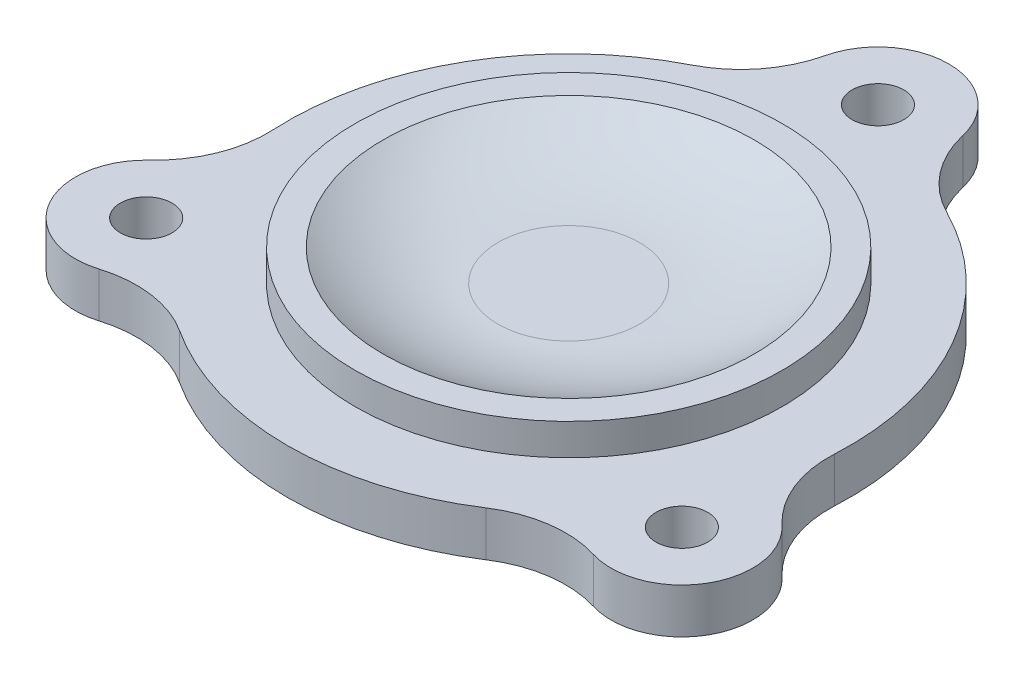
ISO-10303-21;
HEADER;
FILE_DESCRIPTION(('STEP AP214'),'2;1');
FILE_NAME('part.step','',(''),(''),'','','');
FILE_SCHEMA(('AUTOMOTIVE_DESIGN { 1 0 10303 214 1 1 1 1 }'));
ENDSEC;
DATA;
#1=APPLICATION_CONTEXT('core data for automotive mechanical design processes');
#2=APPLICATION_PROTOCOL_DEFINITION('international standard','automotive_design',2000,#1);
#3=PRODUCT_CONTEXT('',#1,'mechanical');
#4=PRODUCT('Part','Part','',(#3));
#5=PRODUCT_RELATED_PRODUCT_CATEGORY('part','',(#4));
#6=PRODUCT_DEFINITION_FORMATION('','',#4);
#7=PRODUCT_DEFINITION_CONTEXT('part definition',#1,'design');
#8=PRODUCT_DEFINITION('design','',#6,#7);
#9=PRODUCT_DEFINITION_SHAPE('','',#8);
#10=(LENGTH_UNIT() NAMED_UNIT(*) SI_UNIT(.MILLI.,.METRE.));
#11=(NAMED_UNIT(*) PLANE_ANGLE_UNIT() SI_UNIT($,.RADIAN.));
#12=(NAMED_UNIT(*) SI_UNIT($,.STERADIAN.) SOLID_ANGLE_UNIT());
#13=UNCERTAINTY_MEASURE_WITH_UNIT(LENGTH_MEASURE(1.E-05),#10,'distance_accuracy_value','');
#14=(GEOMETRIC_REPRESENTATION_CONTEXT(3) GLOBAL_UNCERTAINTY_ASSIGNED_CONTEXT((#13)) GLOBAL_UNIT_ASSIGNED_CONTEXT((#10,
#11,#12)) REPRESENTATION_CONTEXT('',''));
#15=CARTESIAN_POINT('',(0.,0.,0.));
#16=DIRECTION('',(0.,0.,1.));
#17=DIRECTION('',(1.,0.,0.));
#18=AXIS2_PLACEMENT_3D('',#15,#16,#17);
#19=CARTESIAN_POINT('',(0.,2.,0.));
#20=DIRECTION('',(0.,-1.,0.));
#21=DIRECTION('',(0.,0.,-1.));
#22=AXIS2_PLACEMENT_3D('',#19,#20,#21);
#23=CYLINDRICAL_SURFACE('',#22,12.5);
#24=DIRECTION('',(0.,1.,0.));
#25=VECTOR('',#24,1.);
#26=CARTESIAN_POINT('',(-6.81245686136395,-12.8233262650801,10.4804785917464));
#27=LINE('',#26,#25);
#28=CARTESIAN_POINT('',(-6.81245686136395,0.,10.4804785917464));
#29=VERTEX_POINT('',#28);
#30=CARTESIAN_POINT('',(-6.81245686136395,2.,10.4804785917464));
#31=VERTEX_POINT('',#30);
#32=EDGE_CURVE('E151',#29,#31,#27,.T.);
#33=ORIENTED_EDGE('',*,*,#32,.F.);
#34=CARTESIAN_POINT('',(0.,0.,0.));
#35=DIRECTION('',(0.,1.,0.));
#36=DIRECTION('',(0.,0.,1.));
#37=AXIS2_PLACEMENT_3D('',#34,#35,#36);
#38=CIRCLE('',#37,12.5);
#39=CARTESIAN_POINT('',(6.81245686136395,0.,10.4804785917464));
#40=VERTEX_POINT('',#39);
#41=EDGE_CURVE('E236',#29,#40,#38,.T.);
#42=ORIENTED_EDGE('',*,*,#41,.T.);
#43=DIRECTION('',(0.,1.,0.));
#44=VECTOR('',#43,1.);
#45=CARTESIAN_POINT('',(6.81245686136395,-12.8233262650801,10.4804785917464));
#46=LINE('',#45,#44);
#47=CARTESIAN_POINT('',(6.81245686136395,2.,10.4804785917464));
#48=VERTEX_POINT('',#47);
#49=EDGE_CURVE('E187',#40,#48,#46,.T.);
#50=ORIENTED_EDGE('',*,*,#49,.T.);
#51=CARTESIAN_POINT('',(0.,2.,0.));
#52=DIRECTION('',(0.,1.,0.));
#53=DIRECTION('',(0.,0.,1.));
#54=AXIS2_PLACEMENT_3D('',#51,#52,#53);
#55=CIRCLE('',#54,12.5);
#56=EDGE_CURVE('E52',#31,#48,#55,.T.);
#57=ORIENTED_EDGE('',*,*,#56,.F.);
#58=EDGE_LOOP('',(#33,#42,#50,#57));
#59=FACE_BOUND('',#58,.T.);
#60=ADVANCED_FACE('F37',(#59),#23,.T.);
#61=DIRECTION('',(0.,1.,0.));
#62=VECTOR('',#61,1.);
#63=CARTESIAN_POINT('',(12.4825891349533,-12.8233262650801,0.659521408253566));
#64=LINE('',#63,#62);
#65=CARTESIAN_POINT('',(12.4825891349533,0.,0.659521408253566));
#66=VERTEX_POINT('',#65);
#67=CARTESIAN_POINT('',(12.4825891349533,2.,0.659521408253566));
#68=VERTEX_POINT('',#67);
#69=EDGE_CURVE('E183',#66,#68,#64,.T.);
#70=ORIENTED_EDGE('',*,*,#69,.F.);
#71=CARTESIAN_POINT('',(5.67013227358939,0.,-11.14));
#72=VERTEX_POINT('',#71);
#73=EDGE_CURVE('E231',#66,#72,#38,.T.);
#74=ORIENTED_EDGE('',*,*,#73,.T.);
#75=DIRECTION('',(0.,1.,0.));
#76=VECTOR('',#75,1.);
#77=CARTESIAN_POINT('',(5.67013227358939,-12.8233262650801,-11.14));
#78=LINE('',#77,#76);
#79=CARTESIAN_POINT('',(5.67013227358939,2.,-11.14));
#80=VERTEX_POINT('',#79);
#81=EDGE_CURVE('E217',#72,#80,#78,.T.);
#82=ORIENTED_EDGE('',*,*,#81,.T.);
#83=EDGE_CURVE('E234',#68,#80,#55,.T.);
#84=ORIENTED_EDGE('',*,*,#83,.F.);
#85=EDGE_LOOP('',(#70,#74,#82,#84));
#86=FACE_BOUND('',#85,.T.);
#87=ADVANCED_FACE('F240',(#86),#23,.T.);
#88=CARTESIAN_POINT('',(-5.67013227358939,0.,-11.14));
#89=VERTEX_POINT('',#88);
#90=CARTESIAN_POINT('',(-12.4825891349533,0.,0.659521408253576));
#91=VERTEX_POINT('',#90);
#92=EDGE_CURVE('E235',#89,#91,#38,.T.);
#93=ORIENTED_EDGE('',*,*,#92,.T.);
#94=DIRECTION('',(0.,1.,0.));
#95=VECTOR('',#94,1.);
#96=CARTESIAN_POINT('',(-12.4825891349533,-12.8233262650801,0.659521408253575));
#97=LINE('',#96,#95);
#98=CARTESIAN_POINT('',(-12.4825891349533,2.,0.659521408253576));
#99=VERTEX_POINT('',#98);
#100=EDGE_CURVE('E60',#91,#99,#97,.T.);
#101=ORIENTED_EDGE('',*,*,#100,.T.);
#102=CARTESIAN_POINT('',(-5.67013227358939,2.,-11.14));
#103=VERTEX_POINT('',#102);
#104=EDGE_CURVE('E45',#103,#99,#55,.T.);
#105=ORIENTED_EDGE('',*,*,#104,.F.);
#106=DIRECTION('',(0.,1.,0.));
#107=VECTOR('',#106,1.);
#108=CARTESIAN_POINT('',(-5.67013227358939,-12.8233262650801,-11.14));
#109=LINE('',#108,#107);
#110=EDGE_CURVE('E213',#89,#103,#109,.T.);
#111=ORIENTED_EDGE('',*,*,#110,.F.);
#112=EDGE_LOOP('',(#93,#101,#105,#111));
#113=FACE_BOUND('',#112,.T.);
#114=ADVANCED_FACE('F260',(#113),#23,.T.);
#115=CARTESIAN_POINT('',(0.,2.,0.));
#116=DIRECTION('',(0.,1.,0.));
#117=DIRECTION('',(0.,0.,1.));
#118=AXIS2_PLACEMENT_3D('',#115,#116,#117);
#119=PLANE('',#118);
#120=CARTESIAN_POINT('',(0.,2.,0.));
#121=DIRECTION('',(0.,1.,0.));
#122=DIRECTION('',(0.,0.,1.));
#123=AXIS2_PLACEMENT_3D('',#120,#121,#122);
#124=CIRCLE('',#123,9.5);
#125=CARTESIAN_POINT('',(0.,2.,9.5));
#126=VERTEX_POINT('',#125);
#127=EDGE_CURVE('E227',#126,#126,#124,.T.);
#128=ORIENTED_EDGE('',*,*,#127,.F.);
#129=EDGE_LOOP('',(#128));
#130=FACE_BOUND('',#129,.T.);
#131=ORIENTED_EDGE('',*,*,#104,.T.);
#132=CARTESIAN_POINT('',(-17.4756247889347,2.,0.923329971555006));
#133=DIRECTION('',(0.,-1.,0.));
#134=DIRECTION('',(0.,0.,1.));
#135=AXIS2_PLACEMENT_3D('',#132,#133,#134);
#136=CIRCLE('',#135,5.);
#137=CARTESIAN_POINT('',(-14.0598116067883,2.,4.57466127734948));
#138=VERTEX_POINT('',#137);
#139=EDGE_CURVE('E131',#99,#138,#136,.T.);
#140=ORIENTED_EDGE('',*,*,#139,.T.);
#141=CARTESIAN_POINT('',(-11.907849302036,2.,6.87500000000001));
#142=DIRECTION('',(0.,1.,0.));
#143=DIRECTION('',(0.,0.,1.));
#144=AXIS2_PLACEMENT_3D('',#141,#142,#143);
#145=CIRCLE('',#144,3.15);
#146=CARTESIAN_POINT('',(-10.9916786832877,2.,9.88882338522722));
#147=VERTEX_POINT('',#146);
#148=EDGE_CURVE('E144',#138,#147,#145,.T.);
#149=ORIENTED_EDGE('',*,*,#148,.T.);
#150=CARTESIAN_POINT('',(-9.53743960590952,2.,14.672670028445));
#151=DIRECTION('',(0.,-1.,0.));
#152=DIRECTION('',(0.,0.,-1.));
#153=AXIS2_PLACEMENT_3D('',#150,#151,#152);
#154=CIRCLE('',#153,5.);
#155=EDGE_CURVE('E146',#147,#31,#154,.T.);
#156=ORIENTED_EDGE('',*,*,#155,.T.);
#157=ORIENTED_EDGE('',*,*,#56,.T.);
#158=CARTESIAN_POINT('',(9.53743960590953,2.,14.672670028445));
#159=DIRECTION('',(0.,-1.,0.));
#160=DIRECTION('',(0.,0.,1.));
#161=AXIS2_PLACEMENT_3D('',#158,#159,#160);
#162=CIRCLE('',#161,5.);
#163=CARTESIAN_POINT('',(10.9916786832878,2.,9.88882338522721));
#164=VERTEX_POINT('',#163);
#165=EDGE_CURVE('E177',#48,#164,#162,.T.);
#166=ORIENTED_EDGE('',*,*,#165,.T.);
#167=CARTESIAN_POINT('',(11.907849302036,2.,6.875));
#168=DIRECTION('',(0.,1.,0.));
#169=DIRECTION('',(0.,0.,1.));
#170=AXIS2_PLACEMENT_3D('',#167,#168,#169);
#171=CIRCLE('',#170,3.15);
#172=CARTESIAN_POINT('',(14.0598116067883,2.,4.57466127734947));
#173=VERTEX_POINT('',#172);
#174=EDGE_CURVE('E180',#164,#173,#171,.T.);
#175=ORIENTED_EDGE('',*,*,#174,.T.);
#176=CARTESIAN_POINT('',(17.4756247889347,2.,0.923329971554993));
#177=DIRECTION('',(0.,-1.,0.));
#178=DIRECTION('',(0.,0.,-1.));
#179=AXIS2_PLACEMENT_3D('',#176,#177,#178);
#180=CIRCLE('',#179,5.);
#181=EDGE_CURVE('E174',#173,#68,#180,.T.);
#182=ORIENTED_EDGE('',*,*,#181,.T.);
#183=ORIENTED_EDGE('',*,*,#83,.T.);
#184=CARTESIAN_POINT('',(7.93818518302515,2.,-15.596));
#185=DIRECTION('',(0.,-1.,0.));
#186=DIRECTION('',(0.,0.,1.));
#187=AXIS2_PLACEMENT_3D('',#184,#185,#186);
#188=CIRCLE('',#187,5.);
#189=CARTESIAN_POINT('',(3.06813292350052,2.,-14.4634846625767));
#190=VERTEX_POINT('',#189);
#191=EDGE_CURVE('E207',#80,#190,#188,.T.);
#192=ORIENTED_EDGE('',*,*,#191,.T.);
#193=CARTESIAN_POINT('',(0.,2.,-13.75));
#194=DIRECTION('',(0.,1.,0.));
#195=DIRECTION('',(0.,0.,1.));
#196=AXIS2_PLACEMENT_3D('',#193,#194,#195);
#197=CIRCLE('',#196,3.15);
#198=CARTESIAN_POINT('',(-3.06813292350052,2.,-14.4634846625767));
#199=VERTEX_POINT('',#198);
#200=EDGE_CURVE('E210',#190,#199,#197,.T.);
#201=ORIENTED_EDGE('',*,*,#200,.T.);
#202=CARTESIAN_POINT('',(-7.93818518302515,2.,-15.596));
#203=DIRECTION('',(0.,-1.,0.));
#204=DIRECTION('',(0.,0.,-1.));
#205=AXIS2_PLACEMENT_3D('',#202,#203,#204);
#206=CIRCLE('',#205,5.);
#207=EDGE_CURVE('E205',#199,#103,#206,.T.);
#208=ORIENTED_EDGE('',*,*,#207,.T.);
#209=EDGE_LOOP('',(#131,#140,#149,#156,#157,#166,#175,#182,#183,#192,#201,#208));
#210=FACE_BOUND('',#209,.T.);
#211=CARTESIAN_POINT('',(0.,2.,-13.75));
#212=DIRECTION('',(0.,1.,0.));
#213=DIRECTION('',(0.,0.,1.));
#214=AXIS2_PLACEMENT_3D('',#211,#212,#213);
#215=CIRCLE('',#214,1.15);
#216=CARTESIAN_POINT('',(0.,2.,-12.6));
#217=VERTEX_POINT('',#216);
#218=EDGE_CURVE('E193',#217,#217,#215,.T.);
#219=ORIENTED_EDGE('',*,*,#218,.F.);
#220=EDGE_LOOP('',(#219));
#221=FACE_BOUND('',#220,.T.);
#222=CARTESIAN_POINT('',(11.907849302036,2.,6.875));
#223=DIRECTION('',(0.,1.,0.));
#224=DIRECTION('',(0.,0.,1.));
#225=AXIS2_PLACEMENT_3D('',#222,#223,#224);
#226=CIRCLE('',#225,1.15);
#227=CARTESIAN_POINT('',(11.907849302036,2.,8.025));
#228=VERTEX_POINT('',#227);
#229=EDGE_CURVE('E161',#228,#228,#226,.T.);
#230=ORIENTED_EDGE('',*,*,#229,.F.);
#231=EDGE_LOOP('',(#230));
#232=FACE_BOUND('',#231,.T.);
#233=CARTESIAN_POINT('',(-11.907849302036,2.,6.87500000000001));
#234=DIRECTION('',(0.,1.,0.));
#235=DIRECTION('',(0.,0.,1.));
#236=AXIS2_PLACEMENT_3D('',#233,#234,#235);
#237=CIRCLE('',#236,1.15);
#238=CARTESIAN_POINT('',(-11.907849302036,2.,8.02500000000001));
#239=VERTEX_POINT('',#238);
#240=EDGE_CURVE('E281',#239,#239,#237,.T.);
#241=ORIENTED_EDGE('',*,*,#240,.F.);
#242=EDGE_LOOP('',(#241));
#243=FACE_BOUND('',#242,.T.);
#244=ADVANCED_FACE('F141',(#130,#210,#221,#232,#243),#119,.T.);
#245=CARTESIAN_POINT('',(0.,0.,0.));
#246=DIRECTION('',(0.,1.,0.));
#247=DIRECTION('',(0.,0.,1.));
#248=AXIS2_PLACEMENT_3D('',#245,#246,#247);
#249=PLANE('',#248);
#250=ORIENTED_EDGE('',*,*,#92,.F.);
#251=CARTESIAN_POINT('',(-7.93818518302515,0.,-15.596));
#252=DIRECTION('',(0.,1.,0.));
#253=DIRECTION('',(0.,0.,1.));
#254=AXIS2_PLACEMENT_3D('',#251,#252,#253);
#255=CIRCLE('',#254,5.);
#256=CARTESIAN_POINT('',(-3.06813292350052,0.,-14.4634846625767));
#257=VERTEX_POINT('',#256);
#258=EDGE_CURVE('E200',#89,#257,#255,.T.);
#259=ORIENTED_EDGE('',*,*,#258,.T.);
#260=CARTESIAN_POINT('',(0.,0.,-13.75));
#261=DIRECTION('',(0.,1.,0.));
#262=DIRECTION('',(0.,0.,1.));
#263=AXIS2_PLACEMENT_3D('',#260,#261,#262);
#264=CIRCLE('',#263,3.15);
#265=CARTESIAN_POINT('',(3.06813292350052,0.,-14.4634846625767));
#266=VERTEX_POINT('',#265);
#267=EDGE_CURVE('E197',#257,#266,#264,.F.);
#268=ORIENTED_EDGE('',*,*,#267,.T.);
#269=CARTESIAN_POINT('',(7.93818518302515,0.,-15.596));
#270=DIRECTION('',(0.,1.,0.));
#271=DIRECTION('',(0.,0.,1.));
#272=AXIS2_PLACEMENT_3D('',#269,#270,#271);
#273=CIRCLE('',#272,5.);
#274=EDGE_CURVE('E194',#266,#72,#273,.T.);
#275=ORIENTED_EDGE('',*,*,#274,.T.);
#276=ORIENTED_EDGE('',*,*,#73,.F.);
#277=CARTESIAN_POINT('',(17.4756247889347,0.,0.923329971554993));
#278=DIRECTION('',(0.,1.,0.));
#279=DIRECTION('',(0.,0.,1.));
#280=AXIS2_PLACEMENT_3D('',#277,#278,#279);
#281=CIRCLE('',#280,5.);
#282=CARTESIAN_POINT('',(14.0598116067883,0.,4.57466127734947));
#283=VERTEX_POINT('',#282);
#284=EDGE_CURVE('E169',#66,#283,#281,.T.);
#285=ORIENTED_EDGE('',*,*,#284,.T.);
#286=CARTESIAN_POINT('',(11.907849302036,0.,6.875));
#287=DIRECTION('',(0.,1.,0.));
#288=DIRECTION('',(0.,0.,1.));
#289=AXIS2_PLACEMENT_3D('',#286,#287,#288);
#290=CIRCLE('',#289,3.15);
#291=CARTESIAN_POINT('',(10.9916786832878,0.,9.88882338522721));
#292=VERTEX_POINT('',#291);
#293=EDGE_CURVE('E166',#283,#292,#290,.F.);
#294=ORIENTED_EDGE('',*,*,#293,.T.);
#295=CARTESIAN_POINT('',(9.53743960590953,0.,14.672670028445));
#296=DIRECTION('',(0.,1.,0.));
#297=DIRECTION('',(0.,0.,1.));
#298=AXIS2_PLACEMENT_3D('',#295,#296,#297);
#299=CIRCLE('',#298,5.);
#300=EDGE_CURVE('E163',#292,#40,#299,.T.);
#301=ORIENTED_EDGE('',*,*,#300,.T.);
#302=ORIENTED_EDGE('',*,*,#41,.F.);
#303=CARTESIAN_POINT('',(-9.53743960590952,0.,14.672670028445));
#304=DIRECTION('',(0.,1.,0.));
#305=DIRECTION('',(0.,0.,1.));
#306=AXIS2_PLACEMENT_3D('',#303,#304,#305);
#307=CIRCLE('',#306,5.);
#308=CARTESIAN_POINT('',(-10.9916786832877,0.,9.88882338522722));
#309=VERTEX_POINT('',#308);
#310=EDGE_CURVE('E162',#29,#309,#307,.T.);
#311=ORIENTED_EDGE('',*,*,#310,.T.);
#312=CARTESIAN_POINT('',(-11.907849302036,0.,6.87500000000001));
#313=DIRECTION('',(0.,1.,0.));
#314=DIRECTION('',(0.,0.,1.));
#315=AXIS2_PLACEMENT_3D('',#312,#313,#314);
#316=CIRCLE('',#315,3.15);
#317=CARTESIAN_POINT('',(-14.0598116067883,0.,4.57466127734948));
#318=VERTEX_POINT('',#317);
#319=EDGE_CURVE('E276',#309,#318,#316,.F.);
#320=ORIENTED_EDGE('',*,*,#319,.T.);
#321=CARTESIAN_POINT('',(-17.4756247889347,0.,0.923329971555006));
#322=DIRECTION('',(0.,1.,0.));
#323=DIRECTION('',(0.,0.,1.));
#324=AXIS2_PLACEMENT_3D('',#321,#322,#323);
#325=CIRCLE('',#324,5.);
#326=EDGE_CURVE('E133',#318,#91,#325,.T.);
#327=ORIENTED_EDGE('',*,*,#326,.T.);
#328=EDGE_LOOP('',(#250,#259,#268,#275,#276,#285,#294,#301,#302,#311,#320,#327));
#329=FACE_BOUND('',#328,.T.);
#330=CARTESIAN_POINT('',(0.,0.,-13.75));
#331=DIRECTION('',(0.,1.,0.));
#332=DIRECTION('',(0.,0.,1.));
#333=AXIS2_PLACEMENT_3D('',#330,#331,#332);
#334=CIRCLE('',#333,1.15);
#335=CARTESIAN_POINT('',(0.,0.,-12.6));
#336=VERTEX_POINT('',#335);
#337=EDGE_CURVE('E202',#336,#336,#334,.F.);
#338=ORIENTED_EDGE('',*,*,#337,.F.);
#339=EDGE_LOOP('',(#338));
#340=FACE_BOUND('',#339,.T.);
#341=CARTESIAN_POINT('',(11.907849302036,0.,6.875));
#342=DIRECTION('',(0.,1.,0.));
#343=DIRECTION('',(0.,0.,1.));
#344=AXIS2_PLACEMENT_3D('',#341,#342,#343);
#345=CIRCLE('',#344,1.15);
#346=CARTESIAN_POINT('',(11.907849302036,0.,8.025));
#347=VERTEX_POINT('',#346);
#348=EDGE_CURVE('E171',#347,#347,#345,.F.);
#349=ORIENTED_EDGE('',*,*,#348,.F.);
#350=EDGE_LOOP('',(#349));
#351=FACE_BOUND('',#350,.T.);
#352=CARTESIAN_POINT('',(-11.907849302036,0.,6.87500000000001));
#353=DIRECTION('',(0.,1.,0.));
#354=DIRECTION('',(0.,0.,1.));
#355=AXIS2_PLACEMENT_3D('',#352,#353,#354);
#356=CIRCLE('',#355,1.15);
#357=CARTESIAN_POINT('',(-11.907849302036,0.,8.02500000000001));
#358=VERTEX_POINT('',#357);
#359=EDGE_CURVE('E158',#358,#358,#356,.F.);
#360=ORIENTED_EDGE('',*,*,#359,.F.);
#361=EDGE_LOOP('',(#360));
#362=FACE_BOUND('',#361,.T.);
#363=ADVANCED_FACE('F246',(#329,#340,#351,#362),#249,.F.);
#364=CARTESIAN_POINT('',(0.,3.4,0.));
#365=DIRECTION('',(0.,1.,0.));
#366=DIRECTION('',(0.,0.,1.));
#367=AXIS2_PLACEMENT_3D('',#364,#365,#366);
#368=PLANE('',#367);
#369=CARTESIAN_POINT('',(0.,3.4,0.));
#370=DIRECTION('',(0.,1.,0.));
#371=DIRECTION('',(0.,0.,1.));
#372=AXIS2_PLACEMENT_3D('',#369,#370,#371);
#373=CIRCLE('',#372,9.5);
#374=CARTESIAN_POINT('',(0.,3.4,9.5));
#375=VERTEX_POINT('',#374);
#376=EDGE_CURVE('E228',#375,#375,#373,.T.);
#377=ORIENTED_EDGE('',*,*,#376,.T.);
#378=EDGE_LOOP('',(#377));
#379=FACE_BOUND('',#378,.T.);
#380=CARTESIAN_POINT('',(0.,3.4,0.));
#381=DIRECTION('',(0.,1.,0.));
#382=DIRECTION('',(0.,0.,1.));
#383=AXIS2_PLACEMENT_3D('',#380,#381,#382);
#384=CIRCLE('',#383,8.25);
#385=CARTESIAN_POINT('',(0.,3.4,8.25));
#386=VERTEX_POINT('',#385);
#387=EDGE_CURVE('E224',#386,#386,#384,.T.);
#388=ORIENTED_EDGE('',*,*,#387,.F.);
#389=EDGE_LOOP('',(#388));
#390=FACE_BOUND('',#389,.T.);
#391=ADVANCED_FACE('F319',(#379,#390),#368,.T.);
#392=CARTESIAN_POINT('',(0.,3.4,0.));
#393=DIRECTION('',(0.,-1.,0.));
#394=DIRECTION('',(0.,0.,-1.));
#395=AXIS2_PLACEMENT_3D('',#392,#393,#394);
#396=CYLINDRICAL_SURFACE('',#395,9.5);
#397=ORIENTED_EDGE('',*,*,#376,.F.);
#398=EDGE_LOOP('',(#397));
#399=FACE_BOUND('',#398,.T.);
#400=ORIENTED_EDGE('',*,*,#127,.T.);
#401=EDGE_LOOP('',(#400));
#402=FACE_BOUND('',#401,.T.);
#403=ADVANCED_FACE('F322',(#399,#402),#396,.T.);
#404=CARTESIAN_POINT('',(0.,2.,0.));
#405=DIRECTION('',(0.,1.,0.));
#406=DIRECTION('',(0.,0.,1.));
#407=AXIS2_PLACEMENT_3D('',#404,#405,#406);
#408=CIRCLE('',#407,3.14705967113077);
#409=CARTESIAN_POINT('',(0.,2.,3.14705967113077));
#410=VERTEX_POINT('',#409);
#411=EDGE_CURVE('E11',#410,#410,#408,.T.);
#412=ORIENTED_EDGE('',*,*,#411,.T.);
#413=EDGE_LOOP('',(#412));
#414=FACE_BOUND('',#413,.T.);
#415=ADVANCED_FACE('F268',(#414),#119,.T.);
#416=CARTESIAN_POINT('',(0.,12.,0.));
#417=DIRECTION('',(0.,-1.,0.));
#418=DIRECTION('',(0.,0.,-1.));
#419=AXIS2_PLACEMENT_3D('',#416,#417,#418);
#420=DEGENERATE_TOROIDAL_SURFACE('',#419,3.14705967113077,10.,.T.);
#421=ORIENTED_EDGE('',*,*,#411,.F.);
#422=EDGE_LOOP('',(#421));
#423=FACE_BOUND('',#422,.T.);
#424=ORIENTED_EDGE('',*,*,#387,.T.);
#425=EDGE_LOOP('',(#424));
#426=FACE_BOUND('',#425,.T.);
#427=ADVANCED_FACE('F39',(#423,#426),#420,.F.);
#428=CARTESIAN_POINT('',(7.93818518302515,-12.8233262650801,-15.596));
#429=DIRECTION('',(0.,1.,0.));
#430=DIRECTION('',(0.,0.,1.));
#431=AXIS2_PLACEMENT_3D('',#428,#429,#430);
#432=CYLINDRICAL_SURFACE('',#431,5.);
#433=ORIENTED_EDGE('',*,*,#274,.F.);
#434=DIRECTION('',(0.,1.,0.));
#435=VECTOR('',#434,1.);
#436=CARTESIAN_POINT('',(3.06813292350052,-12.8233262650801,-14.4634846625767));
#437=LINE('',#436,#435);
#438=EDGE_CURVE('E215',#266,#190,#437,.T.);
#439=ORIENTED_EDGE('',*,*,#438,.T.);
#440=ORIENTED_EDGE('',*,*,#191,.F.);
#441=ORIENTED_EDGE('',*,*,#81,.F.);
#442=EDGE_LOOP('',(#433,#439,#440,#441));
#443=FACE_BOUND('',#442,.T.);
#444=ADVANCED_FACE('F251',(#443),#432,.F.);
#445=CARTESIAN_POINT('',(0.,-12.8233262650801,-13.75));
#446=DIRECTION('',(0.,1.,0.));
#447=DIRECTION('',(0.,0.,1.));
#448=AXIS2_PLACEMENT_3D('',#445,#446,#447);
#449=CYLINDRICAL_SURFACE('',#448,3.15);
#450=ORIENTED_EDGE('',*,*,#267,.F.);
#451=DIRECTION('',(0.,1.,0.));
#452=VECTOR('',#451,1.);
#453=CARTESIAN_POINT('',(-3.06813292350052,-12.8233262650801,-14.4634846625767));
#454=LINE('',#453,#452);
#455=EDGE_CURVE('E198',#257,#199,#454,.T.);
#456=ORIENTED_EDGE('',*,*,#455,.T.);
#457=ORIENTED_EDGE('',*,*,#200,.F.);
#458=ORIENTED_EDGE('',*,*,#438,.F.);
#459=EDGE_LOOP('',(#450,#456,#457,#458));
#460=FACE_BOUND('',#459,.T.);
#461=ADVANCED_FACE('F254',(#460),#449,.T.);
#462=CARTESIAN_POINT('',(-7.93818518302515,-12.8233262650801,-15.596));
#463=DIRECTION('',(0.,1.,0.));
#464=DIRECTION('',(0.,0.,1.));
#465=AXIS2_PLACEMENT_3D('',#462,#463,#464);
#466=CYLINDRICAL_SURFACE('',#465,5.);
#467=ORIENTED_EDGE('',*,*,#258,.F.);
#468=ORIENTED_EDGE('',*,*,#110,.T.);
#469=ORIENTED_EDGE('',*,*,#207,.F.);
#470=ORIENTED_EDGE('',*,*,#455,.F.);
#471=EDGE_LOOP('',(#467,#468,#469,#470));
#472=FACE_BOUND('',#471,.T.);
#473=ADVANCED_FACE('F259',(#472),#466,.F.);
#474=CARTESIAN_POINT('',(0.,-12.8233262650801,-13.75));
#475=DIRECTION('',(0.,1.,0.));
#476=DIRECTION('',(0.,0.,1.));
#477=AXIS2_PLACEMENT_3D('',#474,#475,#476);
#478=CYLINDRICAL_SURFACE('',#477,1.15);
#479=ORIENTED_EDGE('',*,*,#337,.T.);
#480=EDGE_LOOP('',(#479));
#481=FACE_BOUND('',#480,.T.);
#482=ORIENTED_EDGE('',*,*,#218,.T.);
#483=EDGE_LOOP('',(#482));
#484=FACE_BOUND('',#483,.T.);
#485=ADVANCED_FACE('F309',(#481,#484),#478,.F.);
#486=CARTESIAN_POINT('',(9.53743960590953,-12.8233262650801,14.672670028445));
#487=DIRECTION('',(0.,1.,0.));
#488=DIRECTION('',(0.,0.,1.));
#489=AXIS2_PLACEMENT_3D('',#486,#487,#488);
#490=CYLINDRICAL_SURFACE('',#489,5.);
#491=ORIENTED_EDGE('',*,*,#300,.F.);
#492=DIRECTION('',(0.,1.,0.));
#493=VECTOR('',#492,1.);
#494=CARTESIAN_POINT('',(10.9916786832878,-12.8233262650801,9.88882338522721));
#495=LINE('',#494,#493);
#496=EDGE_CURVE('E185',#292,#164,#495,.T.);
#497=ORIENTED_EDGE('',*,*,#496,.T.);
#498=ORIENTED_EDGE('',*,*,#165,.F.);
#499=ORIENTED_EDGE('',*,*,#49,.F.);
#500=EDGE_LOOP('',(#491,#497,#498,#499));
#501=FACE_BOUND('',#500,.T.);
#502=ADVANCED_FACE('F288',(#501),#490,.F.);
#503=CARTESIAN_POINT('',(11.907849302036,-12.8233262650801,6.875));
#504=DIRECTION('',(0.,1.,0.));
#505=DIRECTION('',(0.,0.,1.));
#506=AXIS2_PLACEMENT_3D('',#503,#504,#505);
#507=CYLINDRICAL_SURFACE('',#506,3.15);
#508=ORIENTED_EDGE('',*,*,#293,.F.);
#509=DIRECTION('',(0.,1.,0.));
#510=VECTOR('',#509,1.);
#511=CARTESIAN_POINT('',(14.0598116067883,-12.8233262650801,4.57466127734947));
#512=LINE('',#511,#510);
#513=EDGE_CURVE('E167',#283,#173,#512,.T.);
#514=ORIENTED_EDGE('',*,*,#513,.T.);
#515=ORIENTED_EDGE('',*,*,#174,.F.);
#516=ORIENTED_EDGE('',*,*,#496,.F.);
#517=EDGE_LOOP('',(#508,#514,#515,#516));
#518=FACE_BOUND('',#517,.T.);
#519=ADVANCED_FACE('F292',(#518),#507,.T.);
#520=CARTESIAN_POINT('',(17.4756247889347,-12.8233262650801,0.923329971554993));
#521=DIRECTION('',(0.,1.,0.));
#522=DIRECTION('',(0.,0.,1.));
#523=AXIS2_PLACEMENT_3D('',#520,#521,#522);
#524=CYLINDRICAL_SURFACE('',#523,5.);
#525=ORIENTED_EDGE('',*,*,#284,.F.);
#526=ORIENTED_EDGE('',*,*,#69,.T.);
#527=ORIENTED_EDGE('',*,*,#181,.F.);
#528=ORIENTED_EDGE('',*,*,#513,.F.);
#529=EDGE_LOOP('',(#525,#526,#527,#528));
#530=FACE_BOUND('',#529,.T.);
#531=ADVANCED_FACE('F296',(#530),#524,.F.);
#532=CARTESIAN_POINT('',(11.907849302036,-12.8233262650801,6.875));
#533=DIRECTION('',(0.,1.,0.));
#534=DIRECTION('',(0.,0.,1.));
#535=AXIS2_PLACEMENT_3D('',#532,#533,#534);
#536=CYLINDRICAL_SURFACE('',#535,1.15);
#537=ORIENTED_EDGE('',*,*,#348,.T.);
#538=EDGE_LOOP('',(#537));
#539=FACE_BOUND('',#538,.T.);
#540=ORIENTED_EDGE('',*,*,#229,.T.);
#541=EDGE_LOOP('',(#540));
#542=FACE_BOUND('',#541,.T.);
#543=ADVANCED_FACE('F298',(#539,#542),#536,.F.);
#544=CARTESIAN_POINT('',(-17.4756247889347,-12.8233262650801,0.923329971555006));
#545=DIRECTION('',(0.,1.,0.));
#546=DIRECTION('',(0.,0.,1.));
#547=AXIS2_PLACEMENT_3D('',#544,#545,#546);
#548=CYLINDRICAL_SURFACE('',#547,5.);
#549=ORIENTED_EDGE('',*,*,#326,.F.);
#550=DIRECTION('',(0.,1.,0.));
#551=VECTOR('',#550,1.);
#552=CARTESIAN_POINT('',(-14.0598116067883,-12.8233262650801,4.57466127734948));
#553=LINE('',#552,#551);
#554=EDGE_CURVE('E128',#318,#138,#553,.T.);
#555=ORIENTED_EDGE('',*,*,#554,.T.);
#556=ORIENTED_EDGE('',*,*,#139,.F.);
#557=ORIENTED_EDGE('',*,*,#100,.F.);
#558=EDGE_LOOP('',(#549,#555,#556,#557));
#559=FACE_BOUND('',#558,.T.);
#560=ADVANCED_FACE('F130',(#559),#548,.F.);
#561=CARTESIAN_POINT('',(-11.907849302036,-12.8233262650801,6.87500000000001));
#562=DIRECTION('',(0.,1.,0.));
#563=DIRECTION('',(0.,0.,1.));
#564=AXIS2_PLACEMENT_3D('',#561,#562,#563);
#565=CYLINDRICAL_SURFACE('',#564,3.15);
#566=ORIENTED_EDGE('',*,*,#319,.F.);
#567=DIRECTION('',(0.,1.,0.));
#568=VECTOR('',#567,1.);
#569=CARTESIAN_POINT('',(-10.9916786832877,-12.8233262650801,9.88882338522722));
#570=LINE('',#569,#568);
#571=EDGE_CURVE('E137',#309,#147,#570,.T.);
#572=ORIENTED_EDGE('',*,*,#571,.T.);
#573=ORIENTED_EDGE('',*,*,#148,.F.);
#574=ORIENTED_EDGE('',*,*,#554,.F.);
#575=EDGE_LOOP('',(#566,#572,#573,#574));
#576=FACE_BOUND('',#575,.T.);
#577=ADVANCED_FACE('F148',(#576),#565,.T.);
#578=CARTESIAN_POINT('',(-9.53743960590952,-12.8233262650801,14.672670028445));
#579=DIRECTION('',(0.,1.,0.));
#580=DIRECTION('',(0.,0.,1.));
#581=AXIS2_PLACEMENT_3D('',#578,#579,#580);
#582=CYLINDRICAL_SURFACE('',#581,5.);
#583=ORIENTED_EDGE('',*,*,#310,.F.);
#584=ORIENTED_EDGE('',*,*,#32,.T.);
#585=ORIENTED_EDGE('',*,*,#155,.F.);
#586=ORIENTED_EDGE('',*,*,#571,.F.);
#587=EDGE_LOOP('',(#583,#584,#585,#586));
#588=FACE_BOUND('',#587,.T.);
#589=ADVANCED_FACE('F275',(#588),#582,.F.);
#590=CARTESIAN_POINT('',(-11.907849302036,-12.8233262650801,6.87500000000001));
#591=DIRECTION('',(0.,1.,0.));
#592=DIRECTION('',(0.,0.,1.));
#593=AXIS2_PLACEMENT_3D('',#590,#591,#592);
#594=CYLINDRICAL_SURFACE('',#593,1.15);
#595=ORIENTED_EDGE('',*,*,#359,.T.);
#596=EDGE_LOOP('',(#595));
#597=FACE_BOUND('',#596,.T.);
#598=ORIENTED_EDGE('',*,*,#240,.T.);
#599=EDGE_LOOP('',(#598));
#600=FACE_BOUND('',#599,.T.);
#601=ADVANCED_FACE('F411',(#597,#600),#594,.F.);
#602=CLOSED_SHELL('',(#60,#87,#114,#244,#363,#391,#403,#415,#427,#444,#461,#473,#485,#502,#519,
#531,#543,#560,#577,#589,#601));
#603=MANIFOLD_SOLID_BREP('B2',#602);
#604=ADVANCED_BREP_SHAPE_REPRESENTATION('',(#18,#603),#14);
#605=SHAPE_DEFINITION_REPRESENTATION(#9,#604);
ENDSEC;
END-ISO-10303-21;
